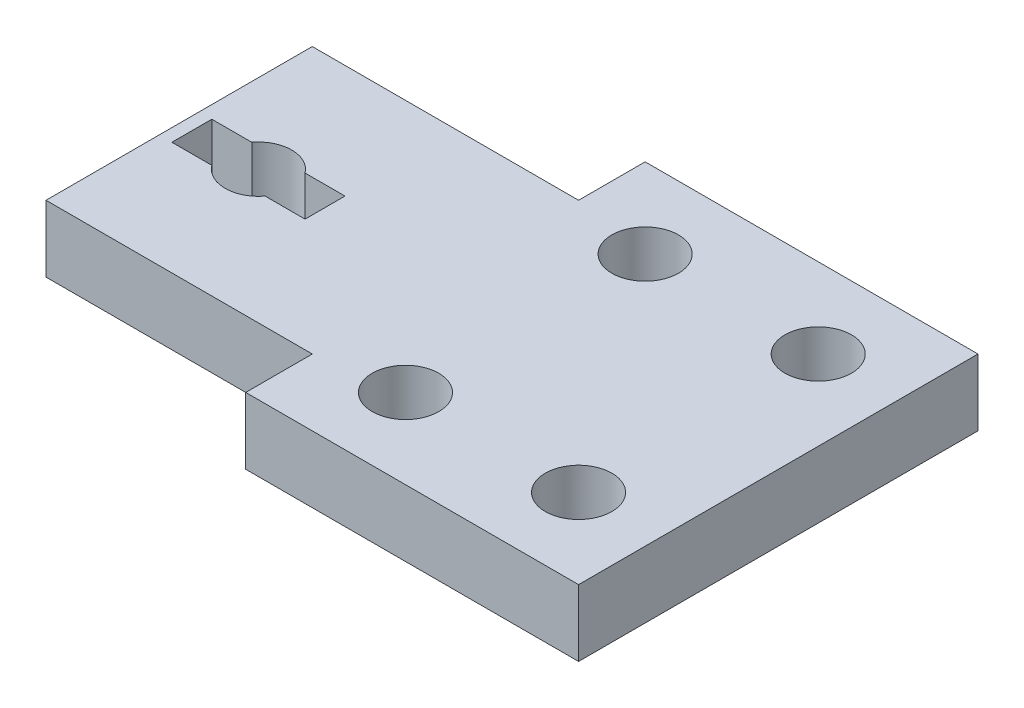
ISO-10303-21;
HEADER;
FILE_DESCRIPTION(('STEP AP214'),'2;1');
FILE_NAME('part.step','',(''),(''),'','','');
FILE_SCHEMA(('AUTOMOTIVE_DESIGN { 1 0 10303 214 1 1 1 1 }'));
ENDSEC;
DATA;
#1=APPLICATION_CONTEXT('core data for automotive mechanical design processes');
#2=APPLICATION_PROTOCOL_DEFINITION('international standard','automotive_design',2000,#1);
#3=PRODUCT_CONTEXT('',#1,'mechanical');
#4=PRODUCT('Part','Part','',(#3));
#5=PRODUCT_RELATED_PRODUCT_CATEGORY('part','',(#4));
#6=PRODUCT_DEFINITION_FORMATION('','',#4);
#7=PRODUCT_DEFINITION_CONTEXT('part definition',#1,'design');
#8=PRODUCT_DEFINITION('design','',#6,#7);
#9=PRODUCT_DEFINITION_SHAPE('','',#8);
#10=(LENGTH_UNIT() NAMED_UNIT(*) SI_UNIT(.MILLI.,.METRE.));
#11=(NAMED_UNIT(*) PLANE_ANGLE_UNIT() SI_UNIT($,.RADIAN.));
#12=(NAMED_UNIT(*) SI_UNIT($,.STERADIAN.) SOLID_ANGLE_UNIT());
#13=UNCERTAINTY_MEASURE_WITH_UNIT(LENGTH_MEASURE(1.E-05),#10,'distance_accuracy_value','');
#14=(GEOMETRIC_REPRESENTATION_CONTEXT(3) GLOBAL_UNCERTAINTY_ASSIGNED_CONTEXT((#13)) GLOBAL_UNIT_ASSIGNED_CONTEXT((#10,
#11,#12)) REPRESENTATION_CONTEXT('',''));
#15=CARTESIAN_POINT('',(0.,0.,0.));
#16=DIRECTION('',(0.,0.,1.));
#17=DIRECTION('',(1.,0.,0.));
#18=AXIS2_PLACEMENT_3D('',#15,#16,#17);
#19=CARTESIAN_POINT('',(0.,5.,30.));
#20=DIRECTION('',(1.,0.,0.));
#21=DIRECTION('',(0.,0.,-1.));
#22=AXIS2_PLACEMENT_3D('',#19,#20,#21);
#23=PLANE('',#22);
#24=DIRECTION('',(0.,-1.,0.));
#25=VECTOR('',#24,1.);
#26=CARTESIAN_POINT('',(0.,5.,5.));
#27=LINE('',#26,#25);
#28=CARTESIAN_POINT('',(0.,5.,5.));
#29=VERTEX_POINT('',#28);
#30=CARTESIAN_POINT('',(0.,0.,5.));
#31=VERTEX_POINT('',#30);
#32=EDGE_CURVE('E228',#29,#31,#27,.T.);
#33=ORIENTED_EDGE('',*,*,#32,.F.);
#34=DIRECTION('',(0.,0.,-1.));
#35=VECTOR('',#34,1.);
#36=CARTESIAN_POINT('',(0.,5.,30.));
#37=LINE('',#36,#35);
#38=CARTESIAN_POINT('',(0.,5.,0.));
#39=VERTEX_POINT('',#38);
#40=EDGE_CURVE('E313',#29,#39,#37,.T.);
#41=ORIENTED_EDGE('',*,*,#40,.T.);
#42=DIRECTION('',(0.,-1.,0.));
#43=VECTOR('',#42,1.);
#44=CARTESIAN_POINT('',(0.,5.,0.));
#45=LINE('',#44,#43);
#46=CARTESIAN_POINT('',(0.,0.,0.));
#47=VERTEX_POINT('',#46);
#48=EDGE_CURVE('E314',#39,#47,#45,.T.);
#49=ORIENTED_EDGE('',*,*,#48,.T.);
#50=DIRECTION('',(0.,0.,-1.));
#51=VECTOR('',#50,1.);
#52=CARTESIAN_POINT('',(0.,0.,30.));
#53=LINE('',#52,#51);
#54=EDGE_CURVE('E47',#31,#47,#53,.T.);
#55=ORIENTED_EDGE('',*,*,#54,.F.);
#56=EDGE_LOOP('',(#33,#41,#49,#55));
#57=FACE_BOUND('',#56,.T.);
#58=ADVANCED_FACE('F38',(#57),#23,.F.);
#59=DIRECTION('',(0.,1.,0.));
#60=VECTOR('',#59,1.);
#61=CARTESIAN_POINT('',(0.,5.,25.));
#62=LINE('',#61,#60);
#63=CARTESIAN_POINT('',(0.,0.,25.));
#64=VERTEX_POINT('',#63);
#65=CARTESIAN_POINT('',(0.,5.,25.));
#66=VERTEX_POINT('',#65);
#67=EDGE_CURVE('E251',#64,#66,#62,.T.);
#68=ORIENTED_EDGE('',*,*,#67,.F.);
#69=CARTESIAN_POINT('',(0.,0.,30.));
#70=VERTEX_POINT('',#69);
#71=EDGE_CURVE('E11',#70,#64,#53,.T.);
#72=ORIENTED_EDGE('',*,*,#71,.F.);
#73=DIRECTION('',(0.,-1.,0.));
#74=VECTOR('',#73,1.);
#75=CARTESIAN_POINT('',(0.,5.,30.));
#76=LINE('',#75,#74);
#77=CARTESIAN_POINT('',(0.,5.,30.));
#78=VERTEX_POINT('',#77);
#79=EDGE_CURVE('E299',#78,#70,#76,.T.);
#80=ORIENTED_EDGE('',*,*,#79,.F.);
#81=EDGE_CURVE('E327',#78,#66,#37,.T.);
#82=ORIENTED_EDGE('',*,*,#81,.T.);
#83=EDGE_LOOP('',(#68,#72,#80,#82));
#84=FACE_BOUND('',#83,.T.);
#85=ADVANCED_FACE('F374',(#84),#23,.F.);
#86=CARTESIAN_POINT('',(0.,0.,30.));
#87=DIRECTION('',(0.,1.,0.));
#88=DIRECTION('',(-1.,0.,0.));
#89=AXIS2_PLACEMENT_3D('',#86,#87,#88);
#90=PLANE('',#89);
#91=DIRECTION('',(1.,0.,0.));
#92=VECTOR('',#91,1.);
#93=CARTESIAN_POINT('',(-16.044559795793,0.,16.5));
#94=LINE('',#93,#92);
#95=CARTESIAN_POINT('',(-19.044559795793,0.,16.5));
#96=VERTEX_POINT('',#95);
#97=CARTESIAN_POINT('',(-16.044559795793,0.,16.5));
#98=VERTEX_POINT('',#97);
#99=EDGE_CURVE('E162',#96,#98,#94,.T.);
#100=ORIENTED_EDGE('',*,*,#99,.T.);
#101=CARTESIAN_POINT('',(-14.044559795793,0.,15.));
#102=DIRECTION('',(0.,1.,0.));
#103=DIRECTION('',(-1.,0.,0.));
#104=AXIS2_PLACEMENT_3D('',#101,#102,#103);
#105=CIRCLE('',#104,2.5);
#106=CARTESIAN_POINT('',(-12.044559795793,0.,16.5));
#107=VERTEX_POINT('',#106);
#108=EDGE_CURVE('E155',#98,#107,#105,.T.);
#109=ORIENTED_EDGE('',*,*,#108,.T.);
#110=DIRECTION('',(1.,0.,0.));
#111=VECTOR('',#110,1.);
#112=CARTESIAN_POINT('',(-9.04455979579295,0.,16.5));
#113=LINE('',#112,#111);
#114=CARTESIAN_POINT('',(-9.04455979579295,0.,16.5));
#115=VERTEX_POINT('',#114);
#116=EDGE_CURVE('E165',#107,#115,#113,.T.);
#117=ORIENTED_EDGE('',*,*,#116,.T.);
#118=DIRECTION('',(0.,0.,-1.));
#119=VECTOR('',#118,1.);
#120=CARTESIAN_POINT('',(-9.04455979579295,0.,13.5));
#121=LINE('',#120,#119);
#122=CARTESIAN_POINT('',(-9.04455979579295,0.,13.5));
#123=VERTEX_POINT('',#122);
#124=EDGE_CURVE('E55',#115,#123,#121,.T.);
#125=ORIENTED_EDGE('',*,*,#124,.T.);
#126=DIRECTION('',(-1.,0.,0.));
#127=VECTOR('',#126,1.);
#128=CARTESIAN_POINT('',(-12.044559795793,0.,13.5));
#129=LINE('',#128,#127);
#130=CARTESIAN_POINT('',(-12.044559795793,0.,13.5));
#131=VERTEX_POINT('',#130);
#132=EDGE_CURVE('E184',#123,#131,#129,.T.);
#133=ORIENTED_EDGE('',*,*,#132,.T.);
#134=CARTESIAN_POINT('',(-14.044559795793,0.,15.));
#135=DIRECTION('',(0.,1.,0.));
#136=DIRECTION('',(-1.,0.,0.));
#137=AXIS2_PLACEMENT_3D('',#134,#135,#136);
#138=CIRCLE('',#137,2.5);
#139=CARTESIAN_POINT('',(-16.044559795793,0.,13.5));
#140=VERTEX_POINT('',#139);
#141=EDGE_CURVE('E188',#131,#140,#138,.T.);
#142=ORIENTED_EDGE('',*,*,#141,.T.);
#143=DIRECTION('',(-1.,0.,0.));
#144=VECTOR('',#143,1.);
#145=CARTESIAN_POINT('',(-19.044559795793,0.,13.5));
#146=LINE('',#145,#144);
#147=CARTESIAN_POINT('',(-19.044559795793,0.,13.5));
#148=VERTEX_POINT('',#147);
#149=EDGE_CURVE('E192',#140,#148,#146,.T.);
#150=ORIENTED_EDGE('',*,*,#149,.T.);
#151=DIRECTION('',(0.,0.,1.));
#152=VECTOR('',#151,1.);
#153=CARTESIAN_POINT('',(-19.044559795793,0.,16.5));
#154=LINE('',#153,#152);
#155=EDGE_CURVE('E196',#148,#96,#154,.T.);
#156=ORIENTED_EDGE('',*,*,#155,.T.);
#157=EDGE_LOOP('',(#100,#109,#117,#125,#133,#142,#150,#156));
#158=FACE_BOUND('',#157,.T.);
#159=CARTESIAN_POINT('',(6.,0.,24.));
#160=DIRECTION('',(0.,1.,0.));
#161=DIRECTION('',(-1.,0.,0.));
#162=AXIS2_PLACEMENT_3D('',#159,#160,#161);
#163=CIRCLE('',#162,2.5);
#164=CARTESIAN_POINT('',(3.5,0.,24.));
#165=VERTEX_POINT('',#164);
#166=EDGE_CURVE('E282',#165,#165,#163,.T.);
#167=ORIENTED_EDGE('',*,*,#166,.T.);
#168=EDGE_LOOP('',(#167));
#169=FACE_BOUND('',#168,.T.);
#170=CARTESIAN_POINT('',(19.,0.,24.));
#171=DIRECTION('',(0.,1.,0.));
#172=DIRECTION('',(-1.,0.,0.));
#173=AXIS2_PLACEMENT_3D('',#170,#171,#172);
#174=CIRCLE('',#173,2.5);
#175=CARTESIAN_POINT('',(16.5,0.,24.));
#176=VERTEX_POINT('',#175);
#177=EDGE_CURVE('E288',#176,#176,#174,.T.);
#178=ORIENTED_EDGE('',*,*,#177,.T.);
#179=EDGE_LOOP('',(#178));
#180=FACE_BOUND('',#179,.T.);
#181=CARTESIAN_POINT('',(19.,0.,6.));
#182=DIRECTION('',(0.,1.,0.));
#183=DIRECTION('',(-1.,0.,0.));
#184=AXIS2_PLACEMENT_3D('',#181,#182,#183);
#185=CIRCLE('',#184,2.5);
#186=CARTESIAN_POINT('',(16.5,0.,6.));
#187=VERTEX_POINT('',#186);
#188=EDGE_CURVE('E283',#187,#187,#185,.T.);
#189=ORIENTED_EDGE('',*,*,#188,.T.);
#190=EDGE_LOOP('',(#189));
#191=FACE_BOUND('',#190,.T.);
#192=CARTESIAN_POINT('',(6.,0.,6.));
#193=DIRECTION('',(0.,1.,0.));
#194=DIRECTION('',(-1.,0.,0.));
#195=AXIS2_PLACEMENT_3D('',#192,#193,#194);
#196=CIRCLE('',#195,2.5);
#197=CARTESIAN_POINT('',(3.5,0.,6.));
#198=VERTEX_POINT('',#197);
#199=EDGE_CURVE('E287',#198,#198,#196,.T.);
#200=ORIENTED_EDGE('',*,*,#199,.T.);
#201=EDGE_LOOP('',(#200));
#202=FACE_BOUND('',#201,.T.);
#203=DIRECTION('',(1.,0.,0.));
#204=VECTOR('',#203,1.);
#205=CARTESIAN_POINT('',(0.,0.,0.));
#206=LINE('',#205,#204);
#207=CARTESIAN_POINT('',(25.,0.,0.));
#208=VERTEX_POINT('',#207);
#209=EDGE_CURVE('E318',#47,#208,#206,.T.);
#210=ORIENTED_EDGE('',*,*,#209,.T.);
#211=DIRECTION('',(0.,0.,-1.));
#212=VECTOR('',#211,1.);
#213=CARTESIAN_POINT('',(25.,0.,30.));
#214=LINE('',#213,#212);
#215=CARTESIAN_POINT('',(25.,0.,30.));
#216=VERTEX_POINT('',#215);
#217=EDGE_CURVE('E334',#216,#208,#214,.T.);
#218=ORIENTED_EDGE('',*,*,#217,.F.);
#219=DIRECTION('',(1.,0.,0.));
#220=VECTOR('',#219,1.);
#221=CARTESIAN_POINT('',(0.,0.,30.));
#222=LINE('',#221,#220);
#223=EDGE_CURVE('E303',#70,#216,#222,.T.);
#224=ORIENTED_EDGE('',*,*,#223,.F.);
#225=ORIENTED_EDGE('',*,*,#71,.T.);
#226=DIRECTION('',(1.,0.,0.));
#227=VECTOR('',#226,1.);
#228=CARTESIAN_POINT('',(-20.,0.,25.));
#229=LINE('',#228,#227);
#230=CARTESIAN_POINT('',(-20.,0.,25.));
#231=VERTEX_POINT('',#230);
#232=EDGE_CURVE('E274',#231,#64,#229,.T.);
#233=ORIENTED_EDGE('',*,*,#232,.F.);
#234=DIRECTION('',(0.,0.,1.));
#235=VECTOR('',#234,1.);
#236=CARTESIAN_POINT('',(-20.,0.,5.));
#237=LINE('',#236,#235);
#238=CARTESIAN_POINT('',(-20.,0.,5.));
#239=VERTEX_POINT('',#238);
#240=EDGE_CURVE('E250',#239,#231,#237,.T.);
#241=ORIENTED_EDGE('',*,*,#240,.F.);
#242=DIRECTION('',(1.,0.,0.));
#243=VECTOR('',#242,1.);
#244=CARTESIAN_POINT('',(-20.,0.,5.));
#245=LINE('',#244,#243);
#246=EDGE_CURVE('E278',#239,#31,#245,.T.);
#247=ORIENTED_EDGE('',*,*,#246,.T.);
#248=ORIENTED_EDGE('',*,*,#54,.T.);
#249=EDGE_LOOP('',(#210,#218,#224,#225,#233,#241,#247,#248));
#250=FACE_BOUND('',#249,.T.);
#251=ADVANCED_FACE('F170',(#158,#169,#180,#191,#202,#250),#90,.F.);
#252=CARTESIAN_POINT('',(25.,0.,30.));
#253=DIRECTION('',(-1.,0.,0.));
#254=DIRECTION('',(0.,0.,1.));
#255=AXIS2_PLACEMENT_3D('',#252,#253,#254);
#256=PLANE('',#255);
#257=DIRECTION('',(0.,1.,0.));
#258=VECTOR('',#257,1.);
#259=CARTESIAN_POINT('',(25.,0.,0.));
#260=LINE('',#259,#258);
#261=CARTESIAN_POINT('',(25.,5.,0.));
#262=VERTEX_POINT('',#261);
#263=EDGE_CURVE('E321',#208,#262,#260,.T.);
#264=ORIENTED_EDGE('',*,*,#263,.T.);
#265=DIRECTION('',(0.,0.,-1.));
#266=VECTOR('',#265,1.);
#267=CARTESIAN_POINT('',(25.,5.,30.));
#268=LINE('',#267,#266);
#269=CARTESIAN_POINT('',(25.,5.,30.));
#270=VERTEX_POINT('',#269);
#271=EDGE_CURVE('E330',#270,#262,#268,.T.);
#272=ORIENTED_EDGE('',*,*,#271,.F.);
#273=DIRECTION('',(0.,1.,0.));
#274=VECTOR('',#273,1.);
#275=CARTESIAN_POINT('',(25.,0.,30.));
#276=LINE('',#275,#274);
#277=EDGE_CURVE('E307',#216,#270,#276,.T.);
#278=ORIENTED_EDGE('',*,*,#277,.F.);
#279=ORIENTED_EDGE('',*,*,#217,.T.);
#280=EDGE_LOOP('',(#264,#272,#278,#279));
#281=FACE_BOUND('',#280,.T.);
#282=ADVANCED_FACE('F410',(#281),#256,.F.);
#283=CARTESIAN_POINT('',(25.,5.,30.));
#284=DIRECTION('',(0.,-1.,0.));
#285=DIRECTION('',(1.,0.,0.));
#286=AXIS2_PLACEMENT_3D('',#283,#284,#285);
#287=PLANE('',#286);
#288=DIRECTION('',(1.,0.,0.));
#289=VECTOR('',#288,1.);
#290=CARTESIAN_POINT('',(-9.04455979579295,5.,16.5));
#291=LINE('',#290,#289);
#292=CARTESIAN_POINT('',(-12.0445597957929,5.,16.5));
#293=VERTEX_POINT('',#292);
#294=CARTESIAN_POINT('',(-9.04455979579295,5.,16.5));
#295=VERTEX_POINT('',#294);
#296=EDGE_CURVE('E203',#293,#295,#291,.T.);
#297=ORIENTED_EDGE('',*,*,#296,.F.);
#298=CARTESIAN_POINT('',(-14.044559795793,5.,15.));
#299=DIRECTION('',(0.,1.,0.));
#300=DIRECTION('',(-1.,0.,0.));
#301=AXIS2_PLACEMENT_3D('',#298,#299,#300);
#302=CIRCLE('',#301,2.5);
#303=CARTESIAN_POINT('',(-16.044559795793,5.,16.5));
#304=VERTEX_POINT('',#303);
#305=EDGE_CURVE('E63',#304,#293,#302,.T.);
#306=ORIENTED_EDGE('',*,*,#305,.F.);
#307=DIRECTION('',(1.,0.,0.));
#308=VECTOR('',#307,1.);
#309=CARTESIAN_POINT('',(-16.044559795793,5.,16.5));
#310=LINE('',#309,#308);
#311=CARTESIAN_POINT('',(-19.044559795793,5.,16.5));
#312=VERTEX_POINT('',#311);
#313=EDGE_CURVE('E175',#312,#304,#310,.T.);
#314=ORIENTED_EDGE('',*,*,#313,.F.);
#315=DIRECTION('',(0.,0.,1.));
#316=VECTOR('',#315,1.);
#317=CARTESIAN_POINT('',(-19.044559795793,5.,16.5));
#318=LINE('',#317,#316);
#319=CARTESIAN_POINT('',(-19.044559795793,5.,13.5));
#320=VERTEX_POINT('',#319);
#321=EDGE_CURVE('E179',#320,#312,#318,.T.);
#322=ORIENTED_EDGE('',*,*,#321,.F.);
#323=DIRECTION('',(-1.,0.,0.));
#324=VECTOR('',#323,1.);
#325=CARTESIAN_POINT('',(-19.044559795793,5.,13.5));
#326=LINE('',#325,#324);
#327=CARTESIAN_POINT('',(-16.044559795793,5.,13.5));
#328=VERTEX_POINT('',#327);
#329=EDGE_CURVE('E218',#328,#320,#326,.T.);
#330=ORIENTED_EDGE('',*,*,#329,.F.);
#331=CARTESIAN_POINT('',(-14.044559795793,5.,15.));
#332=DIRECTION('',(0.,1.,0.));
#333=DIRECTION('',(-1.,0.,0.));
#334=AXIS2_PLACEMENT_3D('',#331,#332,#333);
#335=CIRCLE('',#334,2.5);
#336=CARTESIAN_POINT('',(-12.044559795793,5.,13.5));
#337=VERTEX_POINT('',#336);
#338=EDGE_CURVE('E214',#337,#328,#335,.T.);
#339=ORIENTED_EDGE('',*,*,#338,.F.);
#340=DIRECTION('',(-1.,0.,0.));
#341=VECTOR('',#340,1.);
#342=CARTESIAN_POINT('',(-12.044559795793,5.,13.5));
#343=LINE('',#342,#341);
#344=CARTESIAN_POINT('',(-9.04455979579295,5.,13.5));
#345=VERTEX_POINT('',#344);
#346=EDGE_CURVE('E210',#345,#337,#343,.T.);
#347=ORIENTED_EDGE('',*,*,#346,.F.);
#348=DIRECTION('',(0.,0.,-1.));
#349=VECTOR('',#348,1.);
#350=CARTESIAN_POINT('',(-9.04455979579295,5.,13.5));
#351=LINE('',#350,#349);
#352=EDGE_CURVE('E206',#295,#345,#351,.T.);
#353=ORIENTED_EDGE('',*,*,#352,.F.);
#354=EDGE_LOOP('',(#297,#306,#314,#322,#330,#339,#347,#353));
#355=FACE_BOUND('',#354,.T.);
#356=CARTESIAN_POINT('',(6.,5.,24.));
#357=DIRECTION('',(0.,-1.,0.));
#358=DIRECTION('',(1.,0.,0.));
#359=AXIS2_PLACEMENT_3D('',#356,#357,#358);
#360=CIRCLE('',#359,2.5);
#361=CARTESIAN_POINT('',(8.5,5.,24.));
#362=VERTEX_POINT('',#361);
#363=EDGE_CURVE('E41',#362,#362,#360,.T.);
#364=ORIENTED_EDGE('',*,*,#363,.T.);
#365=EDGE_LOOP('',(#364));
#366=FACE_BOUND('',#365,.T.);
#367=CARTESIAN_POINT('',(19.,5.,24.));
#368=DIRECTION('',(0.,-1.,0.));
#369=DIRECTION('',(1.,0.,0.));
#370=AXIS2_PLACEMENT_3D('',#367,#368,#369);
#371=CIRCLE('',#370,2.5);
#372=CARTESIAN_POINT('',(21.5,5.,24.));
#373=VERTEX_POINT('',#372);
#374=EDGE_CURVE('E344',#373,#373,#371,.T.);
#375=ORIENTED_EDGE('',*,*,#374,.T.);
#376=EDGE_LOOP('',(#375));
#377=FACE_BOUND('',#376,.T.);
#378=CARTESIAN_POINT('',(19.,5.,6.));
#379=DIRECTION('',(0.,-1.,0.));
#380=DIRECTION('',(1.,0.,0.));
#381=AXIS2_PLACEMENT_3D('',#378,#379,#380);
#382=CIRCLE('',#381,2.5);
#383=CARTESIAN_POINT('',(21.5,5.,6.));
#384=VERTEX_POINT('',#383);
#385=EDGE_CURVE('E341',#384,#384,#382,.T.);
#386=ORIENTED_EDGE('',*,*,#385,.T.);
#387=EDGE_LOOP('',(#386));
#388=FACE_BOUND('',#387,.T.);
#389=CARTESIAN_POINT('',(6.,5.,6.));
#390=DIRECTION('',(0.,-1.,0.));
#391=DIRECTION('',(1.,0.,0.));
#392=AXIS2_PLACEMENT_3D('',#389,#390,#391);
#393=CIRCLE('',#392,2.5);
#394=CARTESIAN_POINT('',(8.5,5.,6.));
#395=VERTEX_POINT('',#394);
#396=EDGE_CURVE('E298',#395,#395,#393,.T.);
#397=ORIENTED_EDGE('',*,*,#396,.T.);
#398=EDGE_LOOP('',(#397));
#399=FACE_BOUND('',#398,.T.);
#400=DIRECTION('',(-1.,0.,0.));
#401=VECTOR('',#400,1.);
#402=CARTESIAN_POINT('',(25.,5.,0.));
#403=LINE('',#402,#401);
#404=EDGE_CURVE('E304',#262,#39,#403,.T.);
#405=ORIENTED_EDGE('',*,*,#404,.T.);
#406=ORIENTED_EDGE('',*,*,#40,.F.);
#407=DIRECTION('',(1.,0.,0.));
#408=VECTOR('',#407,1.);
#409=CARTESIAN_POINT('',(-20.,5.,5.));
#410=LINE('',#409,#408);
#411=CARTESIAN_POINT('',(-20.,5.,5.));
#412=VERTEX_POINT('',#411);
#413=EDGE_CURVE('E260',#412,#29,#410,.T.);
#414=ORIENTED_EDGE('',*,*,#413,.F.);
#415=DIRECTION('',(0.,0.,-1.));
#416=VECTOR('',#415,1.);
#417=CARTESIAN_POINT('',(-20.,5.,5.));
#418=LINE('',#417,#416);
#419=CARTESIAN_POINT('',(-20.,5.,25.));
#420=VERTEX_POINT('',#419);
#421=EDGE_CURVE('E257',#420,#412,#418,.T.);
#422=ORIENTED_EDGE('',*,*,#421,.F.);
#423=DIRECTION('',(1.,0.,0.));
#424=VECTOR('',#423,1.);
#425=CARTESIAN_POINT('',(-20.,5.,25.));
#426=LINE('',#425,#424);
#427=EDGE_CURVE('E270',#420,#66,#426,.T.);
#428=ORIENTED_EDGE('',*,*,#427,.T.);
#429=ORIENTED_EDGE('',*,*,#81,.F.);
#430=DIRECTION('',(-1.,0.,0.));
#431=VECTOR('',#430,1.);
#432=CARTESIAN_POINT('',(25.,5.,30.));
#433=LINE('',#432,#431);
#434=EDGE_CURVE('E310',#270,#78,#433,.T.);
#435=ORIENTED_EDGE('',*,*,#434,.F.);
#436=ORIENTED_EDGE('',*,*,#271,.T.);
#437=EDGE_LOOP('',(#405,#406,#414,#422,#428,#429,#435,#436));
#438=FACE_BOUND('',#437,.T.);
#439=ADVANCED_FACE('F353',(#355,#366,#377,#388,#399,#438),#287,.F.);
#440=CARTESIAN_POINT('',(0.,0.,30.));
#441=DIRECTION('',(0.,0.,1.));
#442=DIRECTION('',(1.,0.,0.));
#443=AXIS2_PLACEMENT_3D('',#440,#441,#442);
#444=PLANE('',#443);
#445=ORIENTED_EDGE('',*,*,#79,.T.);
#446=ORIENTED_EDGE('',*,*,#223,.T.);
#447=ORIENTED_EDGE('',*,*,#277,.T.);
#448=ORIENTED_EDGE('',*,*,#434,.T.);
#449=EDGE_LOOP('',(#445,#446,#447,#448));
#450=FACE_BOUND('',#449,.T.);
#451=ADVANCED_FACE('F403',(#450),#444,.T.);
#452=CARTESIAN_POINT('',(0.,0.,0.));
#453=DIRECTION('',(0.,0.,1.));
#454=DIRECTION('',(1.,0.,0.));
#455=AXIS2_PLACEMENT_3D('',#452,#453,#454);
#456=PLANE('',#455);
#457=ORIENTED_EDGE('',*,*,#48,.F.);
#458=ORIENTED_EDGE('',*,*,#404,.F.);
#459=ORIENTED_EDGE('',*,*,#263,.F.);
#460=ORIENTED_EDGE('',*,*,#209,.F.);
#461=EDGE_LOOP('',(#457,#458,#459,#460));
#462=FACE_BOUND('',#461,.T.);
#463=ADVANCED_FACE('F408',(#462),#456,.F.);
#464=CARTESIAN_POINT('',(6.,0.,6.));
#465=DIRECTION('',(0.,1.,0.));
#466=DIRECTION('',(-1.,0.,0.));
#467=AXIS2_PLACEMENT_3D('',#464,#465,#466);
#468=CYLINDRICAL_SURFACE('',#467,2.5);
#469=ORIENTED_EDGE('',*,*,#199,.F.);
#470=EDGE_LOOP('',(#469));
#471=FACE_BOUND('',#470,.T.);
#472=ORIENTED_EDGE('',*,*,#396,.F.);
#473=EDGE_LOOP('',(#472));
#474=FACE_BOUND('',#473,.T.);
#475=ADVANCED_FACE('F422',(#471,#474),#468,.F.);
#476=CARTESIAN_POINT('',(19.,0.,6.));
#477=DIRECTION('',(0.,1.,0.));
#478=DIRECTION('',(-1.,0.,0.));
#479=AXIS2_PLACEMENT_3D('',#476,#477,#478);
#480=CYLINDRICAL_SURFACE('',#479,2.5);
#481=ORIENTED_EDGE('',*,*,#188,.F.);
#482=EDGE_LOOP('',(#481));
#483=FACE_BOUND('',#482,.T.);
#484=ORIENTED_EDGE('',*,*,#385,.F.);
#485=EDGE_LOOP('',(#484));
#486=FACE_BOUND('',#485,.T.);
#487=ADVANCED_FACE('F368',(#483,#486),#480,.F.);
#488=CARTESIAN_POINT('',(19.,0.,24.));
#489=DIRECTION('',(0.,1.,0.));
#490=DIRECTION('',(-1.,0.,0.));
#491=AXIS2_PLACEMENT_3D('',#488,#489,#490);
#492=CYLINDRICAL_SURFACE('',#491,2.5);
#493=ORIENTED_EDGE('',*,*,#177,.F.);
#494=EDGE_LOOP('',(#493));
#495=FACE_BOUND('',#494,.T.);
#496=ORIENTED_EDGE('',*,*,#374,.F.);
#497=EDGE_LOOP('',(#496));
#498=FACE_BOUND('',#497,.T.);
#499=ADVANCED_FACE('F358',(#495,#498),#492,.F.);
#500=CARTESIAN_POINT('',(6.,0.,24.));
#501=DIRECTION('',(0.,1.,0.));
#502=DIRECTION('',(-1.,0.,0.));
#503=AXIS2_PLACEMENT_3D('',#500,#501,#502);
#504=CYLINDRICAL_SURFACE('',#503,2.5);
#505=ORIENTED_EDGE('',*,*,#166,.F.);
#506=EDGE_LOOP('',(#505));
#507=FACE_BOUND('',#506,.T.);
#508=ORIENTED_EDGE('',*,*,#363,.F.);
#509=EDGE_LOOP('',(#508));
#510=FACE_BOUND('',#509,.T.);
#511=ADVANCED_FACE('F355',(#507,#510),#504,.F.);
#512=CARTESIAN_POINT('',(-20.,5.,5.));
#513=DIRECTION('',(0.,0.,1.));
#514=DIRECTION('',(1.,0.,0.));
#515=AXIS2_PLACEMENT_3D('',#512,#513,#514);
#516=PLANE('',#515);
#517=ORIENTED_EDGE('',*,*,#32,.T.);
#518=ORIENTED_EDGE('',*,*,#246,.F.);
#519=DIRECTION('',(0.,-1.,0.));
#520=VECTOR('',#519,1.);
#521=CARTESIAN_POINT('',(-20.,5.,5.));
#522=LINE('',#521,#520);
#523=EDGE_CURVE('E246',#412,#239,#522,.T.);
#524=ORIENTED_EDGE('',*,*,#523,.F.);
#525=ORIENTED_EDGE('',*,*,#413,.T.);
#526=EDGE_LOOP('',(#517,#518,#524,#525));
#527=FACE_BOUND('',#526,.T.);
#528=ADVANCED_FACE('F357',(#527),#516,.F.);
#529=CARTESIAN_POINT('',(-20.,5.,25.));
#530=DIRECTION('',(0.,0.,-1.));
#531=DIRECTION('',(-1.,0.,0.));
#532=AXIS2_PLACEMENT_3D('',#529,#530,#531);
#533=PLANE('',#532);
#534=ORIENTED_EDGE('',*,*,#67,.T.);
#535=ORIENTED_EDGE('',*,*,#427,.F.);
#536=DIRECTION('',(0.,1.,0.));
#537=VECTOR('',#536,1.);
#538=CARTESIAN_POINT('',(-20.,5.,25.));
#539=LINE('',#538,#537);
#540=EDGE_CURVE('E254',#231,#420,#539,.T.);
#541=ORIENTED_EDGE('',*,*,#540,.F.);
#542=ORIENTED_EDGE('',*,*,#232,.T.);
#543=EDGE_LOOP('',(#534,#535,#541,#542));
#544=FACE_BOUND('',#543,.T.);
#545=ADVANCED_FACE('F365',(#544),#533,.F.);
#546=CARTESIAN_POINT('',(-20.,0.,0.));
#547=DIRECTION('',(-1.,0.,0.));
#548=DIRECTION('',(0.,0.,1.));
#549=AXIS2_PLACEMENT_3D('',#546,#547,#548);
#550=PLANE('',#549);
#551=ORIENTED_EDGE('',*,*,#523,.T.);
#552=ORIENTED_EDGE('',*,*,#240,.T.);
#553=ORIENTED_EDGE('',*,*,#540,.T.);
#554=ORIENTED_EDGE('',*,*,#421,.T.);
#555=EDGE_LOOP('',(#551,#552,#553,#554));
#556=FACE_BOUND('',#555,.T.);
#557=ADVANCED_FACE('F390',(#556),#550,.T.);
#558=CARTESIAN_POINT('',(-14.044559795793,0.,15.));
#559=DIRECTION('',(0.,1.,0.));
#560=DIRECTION('',(-1.,0.,0.));
#561=AXIS2_PLACEMENT_3D('',#558,#559,#560);
#562=CYLINDRICAL_SURFACE('',#561,2.5);
#563=ORIENTED_EDGE('',*,*,#305,.T.);
#564=DIRECTION('',(0.,1.,0.));
#565=VECTOR('',#564,1.);
#566=CARTESIAN_POINT('',(-12.044559795793,0.,16.5));
#567=LINE('',#566,#565);
#568=EDGE_CURVE('E151',#107,#293,#567,.T.);
#569=ORIENTED_EDGE('',*,*,#568,.F.);
#570=ORIENTED_EDGE('',*,*,#108,.F.);
#571=DIRECTION('',(0.,1.,0.));
#572=VECTOR('',#571,1.);
#573=CARTESIAN_POINT('',(-16.044559795793,0.,16.5));
#574=LINE('',#573,#572);
#575=EDGE_CURVE('E225',#98,#304,#574,.T.);
#576=ORIENTED_EDGE('',*,*,#575,.T.);
#577=EDGE_LOOP('',(#563,#569,#570,#576));
#578=FACE_BOUND('',#577,.T.);
#579=ADVANCED_FACE('F153',(#578),#562,.F.);
#580=CARTESIAN_POINT('',(-16.044559795793,0.,16.5));
#581=DIRECTION('',(0.,0.,1.));
#582=DIRECTION('',(1.,0.,0.));
#583=AXIS2_PLACEMENT_3D('',#580,#581,#582);
#584=PLANE('',#583);
#585=ORIENTED_EDGE('',*,*,#313,.T.);
#586=ORIENTED_EDGE('',*,*,#575,.F.);
#587=ORIENTED_EDGE('',*,*,#99,.F.);
#588=DIRECTION('',(0.,1.,0.));
#589=VECTOR('',#588,1.);
#590=CARTESIAN_POINT('',(-19.044559795793,0.,16.5));
#591=LINE('',#590,#589);
#592=EDGE_CURVE('E229',#96,#312,#591,.T.);
#593=ORIENTED_EDGE('',*,*,#592,.T.);
#594=EDGE_LOOP('',(#585,#586,#587,#593));
#595=FACE_BOUND('',#594,.T.);
#596=ADVANCED_FACE('F447',(#595),#584,.F.);
#597=CARTESIAN_POINT('',(-19.044559795793,0.,16.5));
#598=DIRECTION('',(-1.,0.,0.));
#599=DIRECTION('',(0.,-1.,0.));
#600=AXIS2_PLACEMENT_3D('',#597,#598,#599);
#601=PLANE('',#600);
#602=ORIENTED_EDGE('',*,*,#321,.T.);
#603=ORIENTED_EDGE('',*,*,#592,.F.);
#604=ORIENTED_EDGE('',*,*,#155,.F.);
#605=DIRECTION('',(0.,1.,0.));
#606=VECTOR('',#605,1.);
#607=CARTESIAN_POINT('',(-19.044559795793,0.,13.5));
#608=LINE('',#607,#606);
#609=EDGE_CURVE('E232',#148,#320,#608,.T.);
#610=ORIENTED_EDGE('',*,*,#609,.T.);
#611=EDGE_LOOP('',(#602,#603,#604,#610));
#612=FACE_BOUND('',#611,.T.);
#613=ADVANCED_FACE('F464',(#612),#601,.F.);
#614=CARTESIAN_POINT('',(-19.044559795793,0.,13.5));
#615=DIRECTION('',(0.,0.,-1.));
#616=DIRECTION('',(-1.,0.,0.));
#617=AXIS2_PLACEMENT_3D('',#614,#615,#616);
#618=PLANE('',#617);
#619=ORIENTED_EDGE('',*,*,#329,.T.);
#620=ORIENTED_EDGE('',*,*,#609,.F.);
#621=ORIENTED_EDGE('',*,*,#149,.F.);
#622=DIRECTION('',(0.,1.,0.));
#623=VECTOR('',#622,1.);
#624=CARTESIAN_POINT('',(-16.044559795793,0.,13.5));
#625=LINE('',#624,#623);
#626=EDGE_CURVE('E235',#140,#328,#625,.T.);
#627=ORIENTED_EDGE('',*,*,#626,.T.);
#628=EDGE_LOOP('',(#619,#620,#621,#627));
#629=FACE_BOUND('',#628,.T.);
#630=ADVANCED_FACE('F460',(#629),#618,.F.);
#631=CARTESIAN_POINT('',(-14.044559795793,0.,15.));
#632=DIRECTION('',(0.,1.,0.));
#633=DIRECTION('',(-1.,0.,0.));
#634=AXIS2_PLACEMENT_3D('',#631,#632,#633);
#635=CYLINDRICAL_SURFACE('',#634,2.5);
#636=ORIENTED_EDGE('',*,*,#338,.T.);
#637=ORIENTED_EDGE('',*,*,#626,.F.);
#638=ORIENTED_EDGE('',*,*,#141,.F.);
#639=DIRECTION('',(0.,1.,0.));
#640=VECTOR('',#639,1.);
#641=CARTESIAN_POINT('',(-12.044559795793,0.,13.5));
#642=LINE('',#641,#640);
#643=EDGE_CURVE('E238',#131,#337,#642,.T.);
#644=ORIENTED_EDGE('',*,*,#643,.T.);
#645=EDGE_LOOP('',(#636,#637,#638,#644));
#646=FACE_BOUND('',#645,.T.);
#647=ADVANCED_FACE('F456',(#646),#635,.F.);
#648=CARTESIAN_POINT('',(-12.044559795793,0.,13.5));
#649=DIRECTION('',(0.,0.,-1.));
#650=DIRECTION('',(-1.,0.,0.));
#651=AXIS2_PLACEMENT_3D('',#648,#649,#650);
#652=PLANE('',#651);
#653=ORIENTED_EDGE('',*,*,#346,.T.);
#654=ORIENTED_EDGE('',*,*,#643,.F.);
#655=ORIENTED_EDGE('',*,*,#132,.F.);
#656=DIRECTION('',(0.,1.,0.));
#657=VECTOR('',#656,1.);
#658=CARTESIAN_POINT('',(-9.04455979579295,0.,13.5));
#659=LINE('',#658,#657);
#660=EDGE_CURVE('E241',#123,#345,#659,.T.);
#661=ORIENTED_EDGE('',*,*,#660,.T.);
#662=EDGE_LOOP('',(#653,#654,#655,#661));
#663=FACE_BOUND('',#662,.T.);
#664=ADVANCED_FACE('F453',(#663),#652,.F.);
#665=CARTESIAN_POINT('',(-9.04455979579295,0.,13.5));
#666=DIRECTION('',(1.,0.,0.));
#667=DIRECTION('',(0.,1.,0.));
#668=AXIS2_PLACEMENT_3D('',#665,#666,#667);
#669=PLANE('',#668);
#670=ORIENTED_EDGE('',*,*,#352,.T.);
#671=ORIENTED_EDGE('',*,*,#660,.F.);
#672=ORIENTED_EDGE('',*,*,#124,.F.);
#673=DIRECTION('',(0.,1.,0.));
#674=VECTOR('',#673,1.);
#675=CARTESIAN_POINT('',(-9.04455979579295,0.,16.5));
#676=LINE('',#675,#674);
#677=EDGE_CURVE('E161',#115,#295,#676,.T.);
#678=ORIENTED_EDGE('',*,*,#677,.T.);
#679=EDGE_LOOP('',(#670,#671,#672,#678));
#680=FACE_BOUND('',#679,.T.);
#681=ADVANCED_FACE('F450',(#680),#669,.F.);
#682=CARTESIAN_POINT('',(-9.04455979579295,0.,16.5));
#683=DIRECTION('',(0.,0.,1.));
#684=DIRECTION('',(1.,0.,0.));
#685=AXIS2_PLACEMENT_3D('',#682,#683,#684);
#686=PLANE('',#685);
#687=ORIENTED_EDGE('',*,*,#296,.T.);
#688=ORIENTED_EDGE('',*,*,#677,.F.);
#689=ORIENTED_EDGE('',*,*,#116,.F.);
#690=ORIENTED_EDGE('',*,*,#568,.T.);
#691=EDGE_LOOP('',(#687,#688,#689,#690));
#692=FACE_BOUND('',#691,.T.);
#693=ADVANCED_FACE('F166',(#692),#686,.F.);
#694=CLOSED_SHELL('',(#58,#85,#251,#282,#439,#451,#463,#475,#487,#499,#511,#528,#545,#557,#579,
#596,#613,#630,#647,#664,#681,#693));
#695=MANIFOLD_SOLID_BREP('B2',#694);
#696=ADVANCED_BREP_SHAPE_REPRESENTATION('',(#18,#695),#14);
#697=SHAPE_DEFINITION_REPRESENTATION(#9,#696);
ENDSEC;
END-ISO-10303-21;
